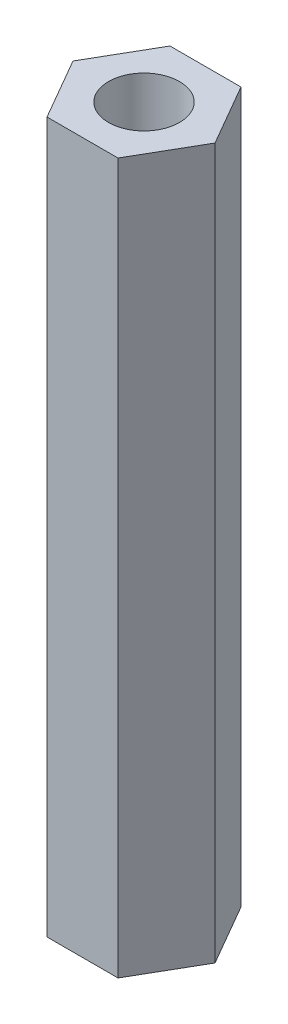
ISO-10303-21;
HEADER;
FILE_DESCRIPTION(('STEP AP214'),'2;1');
FILE_NAME('part.step','',(''),(''),'','','');
FILE_SCHEMA(('AUTOMOTIVE_DESIGN { 1 0 10303 214 1 1 1 1 }'));
ENDSEC;
DATA;
#1=APPLICATION_CONTEXT('core data for automotive mechanical design processes');
#2=APPLICATION_PROTOCOL_DEFINITION('international standard','automotive_design',2000,#1);
#3=PRODUCT_CONTEXT('',#1,'mechanical');
#4=PRODUCT('Part','Part','',(#3));
#5=PRODUCT_RELATED_PRODUCT_CATEGORY('part','',(#4));
#6=PRODUCT_DEFINITION_FORMATION('','',#4);
#7=PRODUCT_DEFINITION_CONTEXT('part definition',#1,'design');
#8=PRODUCT_DEFINITION('design','',#6,#7);
#9=PRODUCT_DEFINITION_SHAPE('','',#8);
#10=(LENGTH_UNIT() NAMED_UNIT(*) SI_UNIT(.MILLI.,.METRE.));
#11=(NAMED_UNIT(*) PLANE_ANGLE_UNIT() SI_UNIT($,.RADIAN.));
#12=(NAMED_UNIT(*) SI_UNIT($,.STERADIAN.) SOLID_ANGLE_UNIT());
#13=UNCERTAINTY_MEASURE_WITH_UNIT(LENGTH_MEASURE(1.E-05),#10,'distance_accuracy_value','');
#14=(GEOMETRIC_REPRESENTATION_CONTEXT(3) GLOBAL_UNCERTAINTY_ASSIGNED_CONTEXT((#13)) GLOBAL_UNIT_ASSIGNED_CONTEXT((#10,
#11,#12)) REPRESENTATION_CONTEXT('',''));
#15=CARTESIAN_POINT('',(0.,0.,0.));
#16=DIRECTION('',(0.,0.,1.));
#17=DIRECTION('',(1.,0.,0.));
#18=AXIS2_PLACEMENT_3D('',#15,#16,#17);
#19=CARTESIAN_POINT('',(0.,30.,0.));
#20=DIRECTION('',(0.,1.,0.));
#21=DIRECTION('',(0.,0.,1.));
#22=AXIS2_PLACEMENT_3D('',#19,#20,#21);
#23=PLANE('',#22);
#24=DIRECTION('',(0.5,0.,0.866025403784439));
#25=VECTOR('',#24,1.);
#26=CARTESIAN_POINT('',(-3.,30.,0.));
#27=LINE('',#26,#25);
#28=CARTESIAN_POINT('',(-3.,30.,0.));
#29=VERTEX_POINT('',#28);
#30=CARTESIAN_POINT('',(-1.5,30.,2.59807621135332));
#31=VERTEX_POINT('',#30);
#32=EDGE_CURVE('E132',#29,#31,#27,.T.);
#33=ORIENTED_EDGE('',*,*,#32,.T.);
#34=DIRECTION('',(1.,0.,0.));
#35=VECTOR('',#34,1.);
#36=CARTESIAN_POINT('',(-1.5,30.,2.59807621135332));
#37=LINE('',#36,#35);
#38=CARTESIAN_POINT('',(1.5,30.,2.59807621135332));
#39=VERTEX_POINT('',#38);
#40=EDGE_CURVE('E90',#31,#39,#37,.T.);
#41=ORIENTED_EDGE('',*,*,#40,.T.);
#42=DIRECTION('',(0.5,0.,-0.866025403784439));
#43=VECTOR('',#42,1.);
#44=CARTESIAN_POINT('',(1.5,30.,2.59807621135332));
#45=LINE('',#44,#43);
#46=CARTESIAN_POINT('',(3.,30.,0.));
#47=VERTEX_POINT('',#46);
#48=EDGE_CURVE('E103',#39,#47,#45,.T.);
#49=ORIENTED_EDGE('',*,*,#48,.T.);
#50=DIRECTION('',(-0.5,0.,-0.866025403784439));
#51=VECTOR('',#50,1.);
#52=CARTESIAN_POINT('',(3.,30.,0.));
#53=LINE('',#52,#51);
#54=CARTESIAN_POINT('',(1.5,30.,-2.59807621135332));
#55=VERTEX_POINT('',#54);
#56=EDGE_CURVE('E97',#47,#55,#53,.T.);
#57=ORIENTED_EDGE('',*,*,#56,.T.);
#58=DIRECTION('',(-1.,0.,0.));
#59=VECTOR('',#58,1.);
#60=CARTESIAN_POINT('',(1.5,30.,-2.59807621135332));
#61=LINE('',#60,#59);
#62=CARTESIAN_POINT('',(-1.5,30.,-2.59807621135332));
#63=VERTEX_POINT('',#62);
#64=EDGE_CURVE('E101',#55,#63,#61,.T.);
#65=ORIENTED_EDGE('',*,*,#64,.T.);
#66=DIRECTION('',(-0.5,0.,0.866025403784439));
#67=VECTOR('',#66,1.);
#68=CARTESIAN_POINT('',(-1.5,30.,-2.59807621135332));
#69=LINE('',#68,#67);
#70=EDGE_CURVE('E53',#63,#29,#69,.T.);
#71=ORIENTED_EDGE('',*,*,#70,.T.);
#72=EDGE_LOOP('',(#33,#41,#49,#57,#65,#71));
#73=FACE_BOUND('',#72,.T.);
#74=CARTESIAN_POINT('',(0.,30.,0.));
#75=DIRECTION('',(0.,1.,0.));
#76=DIRECTION('',(0.,0.,1.));
#77=AXIS2_PLACEMENT_3D('',#74,#75,#76);
#78=CIRCLE('',#77,1.5);
#79=CARTESIAN_POINT('',(0.,30.,1.5));
#80=VERTEX_POINT('',#79);
#81=EDGE_CURVE('E125',#80,#80,#78,.T.);
#82=ORIENTED_EDGE('',*,*,#81,.F.);
#83=EDGE_LOOP('',(#82));
#84=FACE_BOUND('',#83,.T.);
#85=ADVANCED_FACE('F36',(#73,#84),#23,.T.);
#86=CARTESIAN_POINT('',(0.,0.,0.));
#87=DIRECTION('',(0.,1.,0.));
#88=DIRECTION('',(0.,0.,1.));
#89=AXIS2_PLACEMENT_3D('',#86,#87,#88);
#90=PLANE('',#89);
#91=DIRECTION('',(0.5,0.,0.866025403784439));
#92=VECTOR('',#91,1.);
#93=CARTESIAN_POINT('',(-3.,0.,0.));
#94=LINE('',#93,#92);
#95=CARTESIAN_POINT('',(-3.,0.,0.));
#96=VERTEX_POINT('',#95);
#97=CARTESIAN_POINT('',(-1.5,0.,2.59807621135332));
#98=VERTEX_POINT('',#97);
#99=EDGE_CURVE('E121',#96,#98,#94,.T.);
#100=ORIENTED_EDGE('',*,*,#99,.F.);
#101=DIRECTION('',(-0.5,0.,0.866025403784439));
#102=VECTOR('',#101,1.);
#103=CARTESIAN_POINT('',(-1.5,0.,-2.59807621135332));
#104=LINE('',#103,#102);
#105=CARTESIAN_POINT('',(-1.5,0.,-2.59807621135332));
#106=VERTEX_POINT('',#105);
#107=EDGE_CURVE('E82',#106,#96,#104,.T.);
#108=ORIENTED_EDGE('',*,*,#107,.F.);
#109=DIRECTION('',(-1.,0.,0.));
#110=VECTOR('',#109,1.);
#111=CARTESIAN_POINT('',(1.5,0.,-2.59807621135332));
#112=LINE('',#111,#110);
#113=CARTESIAN_POINT('',(1.5,0.,-2.59807621135332));
#114=VERTEX_POINT('',#113);
#115=EDGE_CURVE('E76',#114,#106,#112,.T.);
#116=ORIENTED_EDGE('',*,*,#115,.F.);
#117=DIRECTION('',(-0.5,0.,-0.866025403784439));
#118=VECTOR('',#117,1.);
#119=CARTESIAN_POINT('',(3.,0.,0.));
#120=LINE('',#119,#118);
#121=CARTESIAN_POINT('',(3.,0.,0.));
#122=VERTEX_POINT('',#121);
#123=EDGE_CURVE('E111',#122,#114,#120,.T.);
#124=ORIENTED_EDGE('',*,*,#123,.F.);
#125=DIRECTION('',(0.5,0.,-0.866025403784439));
#126=VECTOR('',#125,1.);
#127=CARTESIAN_POINT('',(1.5,0.,2.59807621135332));
#128=LINE('',#127,#126);
#129=CARTESIAN_POINT('',(1.5,0.,2.59807621135332));
#130=VERTEX_POINT('',#129);
#131=EDGE_CURVE('E127',#130,#122,#128,.T.);
#132=ORIENTED_EDGE('',*,*,#131,.F.);
#133=DIRECTION('',(1.,0.,0.));
#134=VECTOR('',#133,1.);
#135=CARTESIAN_POINT('',(-1.5,0.,2.59807621135332));
#136=LINE('',#135,#134);
#137=EDGE_CURVE('E124',#98,#130,#136,.T.);
#138=ORIENTED_EDGE('',*,*,#137,.F.);
#139=EDGE_LOOP('',(#100,#108,#116,#124,#132,#138));
#140=FACE_BOUND('',#139,.T.);
#141=CARTESIAN_POINT('',(0.,0.,0.));
#142=DIRECTION('',(0.,1.,0.));
#143=DIRECTION('',(0.,0.,1.));
#144=AXIS2_PLACEMENT_3D('',#141,#142,#143);
#145=CIRCLE('',#144,1.5);
#146=CARTESIAN_POINT('',(0.,0.,1.5));
#147=VERTEX_POINT('',#146);
#148=EDGE_CURVE('E225',#147,#147,#145,.T.);
#149=ORIENTED_EDGE('',*,*,#148,.T.);
#150=EDGE_LOOP('',(#149));
#151=FACE_BOUND('',#150,.T.);
#152=ADVANCED_FACE('F141',(#140,#151),#90,.F.);
#153=CARTESIAN_POINT('',(-3.,30.,0.));
#154=DIRECTION('',(0.866025403784439,0.,-0.5));
#155=DIRECTION('',(-0.5,0.,-0.866025403784439));
#156=AXIS2_PLACEMENT_3D('',#153,#154,#155);
#157=PLANE('',#156);
#158=ORIENTED_EDGE('',*,*,#99,.T.);
#159=DIRECTION('',(0.,-1.,0.));
#160=VECTOR('',#159,1.);
#161=CARTESIAN_POINT('',(-1.5,30.,2.59807621135332));
#162=LINE('',#161,#160);
#163=EDGE_CURVE('E11',#31,#98,#162,.T.);
#164=ORIENTED_EDGE('',*,*,#163,.F.);
#165=ORIENTED_EDGE('',*,*,#32,.F.);
#166=DIRECTION('',(0.,-1.,0.));
#167=VECTOR('',#166,1.);
#168=CARTESIAN_POINT('',(-3.,30.,0.));
#169=LINE('',#168,#167);
#170=EDGE_CURVE('E117',#29,#96,#169,.T.);
#171=ORIENTED_EDGE('',*,*,#170,.T.);
#172=EDGE_LOOP('',(#158,#164,#165,#171));
#173=FACE_BOUND('',#172,.T.);
#174=ADVANCED_FACE('F38',(#173),#157,.F.);
#175=CARTESIAN_POINT('',(-1.5,30.,2.59807621135332));
#176=DIRECTION('',(0.,0.,-1.));
#177=DIRECTION('',(-1.,0.,0.));
#178=AXIS2_PLACEMENT_3D('',#175,#176,#177);
#179=PLANE('',#178);
#180=ORIENTED_EDGE('',*,*,#137,.T.);
#181=DIRECTION('',(0.,-1.,0.));
#182=VECTOR('',#181,1.);
#183=CARTESIAN_POINT('',(1.5,30.,2.59807621135332));
#184=LINE('',#183,#182);
#185=EDGE_CURVE('E45',#39,#130,#184,.T.);
#186=ORIENTED_EDGE('',*,*,#185,.F.);
#187=ORIENTED_EDGE('',*,*,#40,.F.);
#188=ORIENTED_EDGE('',*,*,#163,.T.);
#189=EDGE_LOOP('',(#180,#186,#187,#188));
#190=FACE_BOUND('',#189,.T.);
#191=ADVANCED_FACE('F166',(#190),#179,.F.);
#192=CARTESIAN_POINT('',(1.5,30.,2.59807621135332));
#193=DIRECTION('',(-0.866025403784439,0.,-0.5));
#194=DIRECTION('',(-0.5,0.,0.866025403784439));
#195=AXIS2_PLACEMENT_3D('',#192,#193,#194);
#196=PLANE('',#195);
#197=ORIENTED_EDGE('',*,*,#131,.T.);
#198=DIRECTION('',(0.,-1.,0.));
#199=VECTOR('',#198,1.);
#200=CARTESIAN_POINT('',(3.,30.,0.));
#201=LINE('',#200,#199);
#202=EDGE_CURVE('E112',#47,#122,#201,.T.);
#203=ORIENTED_EDGE('',*,*,#202,.F.);
#204=ORIENTED_EDGE('',*,*,#48,.F.);
#205=ORIENTED_EDGE('',*,*,#185,.T.);
#206=EDGE_LOOP('',(#197,#203,#204,#205));
#207=FACE_BOUND('',#206,.T.);
#208=ADVANCED_FACE('F138',(#207),#196,.F.);
#209=CARTESIAN_POINT('',(3.,30.,0.));
#210=DIRECTION('',(-0.866025403784438,0.,0.5));
#211=DIRECTION('',(0.5,0.,0.866025403784439));
#212=AXIS2_PLACEMENT_3D('',#209,#210,#211);
#213=PLANE('',#212);
#214=ORIENTED_EDGE('',*,*,#123,.T.);
#215=DIRECTION('',(0.,-1.,0.));
#216=VECTOR('',#215,1.);
#217=CARTESIAN_POINT('',(1.5,30.,-2.59807621135332));
#218=LINE('',#217,#216);
#219=EDGE_CURVE('E108',#55,#114,#218,.T.);
#220=ORIENTED_EDGE('',*,*,#219,.F.);
#221=ORIENTED_EDGE('',*,*,#56,.F.);
#222=ORIENTED_EDGE('',*,*,#202,.T.);
#223=EDGE_LOOP('',(#214,#220,#221,#222));
#224=FACE_BOUND('',#223,.T.);
#225=ADVANCED_FACE('F109',(#224),#213,.F.);
#226=CARTESIAN_POINT('',(1.5,30.,-2.59807621135332));
#227=DIRECTION('',(0.,0.,1.));
#228=DIRECTION('',(1.,0.,0.));
#229=AXIS2_PLACEMENT_3D('',#226,#227,#228);
#230=PLANE('',#229);
#231=ORIENTED_EDGE('',*,*,#115,.T.);
#232=DIRECTION('',(0.,-1.,0.));
#233=VECTOR('',#232,1.);
#234=CARTESIAN_POINT('',(-1.5,30.,-2.59807621135332));
#235=LINE('',#234,#233);
#236=EDGE_CURVE('E113',#63,#106,#235,.T.);
#237=ORIENTED_EDGE('',*,*,#236,.F.);
#238=ORIENTED_EDGE('',*,*,#64,.F.);
#239=ORIENTED_EDGE('',*,*,#219,.T.);
#240=EDGE_LOOP('',(#231,#237,#238,#239));
#241=FACE_BOUND('',#240,.T.);
#242=ADVANCED_FACE('F115',(#241),#230,.F.);
#243=CARTESIAN_POINT('',(-1.5,30.,-2.59807621135332));
#244=DIRECTION('',(0.866025403784439,0.,0.5));
#245=DIRECTION('',(0.5,0.,-0.866025403784439));
#246=AXIS2_PLACEMENT_3D('',#243,#244,#245);
#247=PLANE('',#246);
#248=ORIENTED_EDGE('',*,*,#107,.T.);
#249=ORIENTED_EDGE('',*,*,#170,.F.);
#250=ORIENTED_EDGE('',*,*,#70,.F.);
#251=ORIENTED_EDGE('',*,*,#236,.T.);
#252=EDGE_LOOP('',(#248,#249,#250,#251));
#253=FACE_BOUND('',#252,.T.);
#254=ADVANCED_FACE('F146',(#253),#247,.F.);
#255=CARTESIAN_POINT('',(0.,30.,0.));
#256=DIRECTION('',(0.,-1.,0.));
#257=DIRECTION('',(0.,0.,-1.));
#258=AXIS2_PLACEMENT_3D('',#255,#256,#257);
#259=CYLINDRICAL_SURFACE('',#258,1.5);
#260=ORIENTED_EDGE('',*,*,#81,.T.);
#261=EDGE_LOOP('',(#260));
#262=FACE_BOUND('',#261,.T.);
#263=ORIENTED_EDGE('',*,*,#148,.F.);
#264=EDGE_LOOP('',(#263));
#265=FACE_BOUND('',#264,.T.);
#266=ADVANCED_FACE('F148',(#262,#265),#259,.F.);
#267=CLOSED_SHELL('',(#85,#152,#174,#191,#208,#225,#242,#254,#266));
#268=MANIFOLD_SOLID_BREP('B2',#267);
#269=ADVANCED_BREP_SHAPE_REPRESENTATION('',(#18,#268),#14);
#270=SHAPE_DEFINITION_REPRESENTATION(#9,#269);
ENDSEC;
END-ISO-10303-21;
